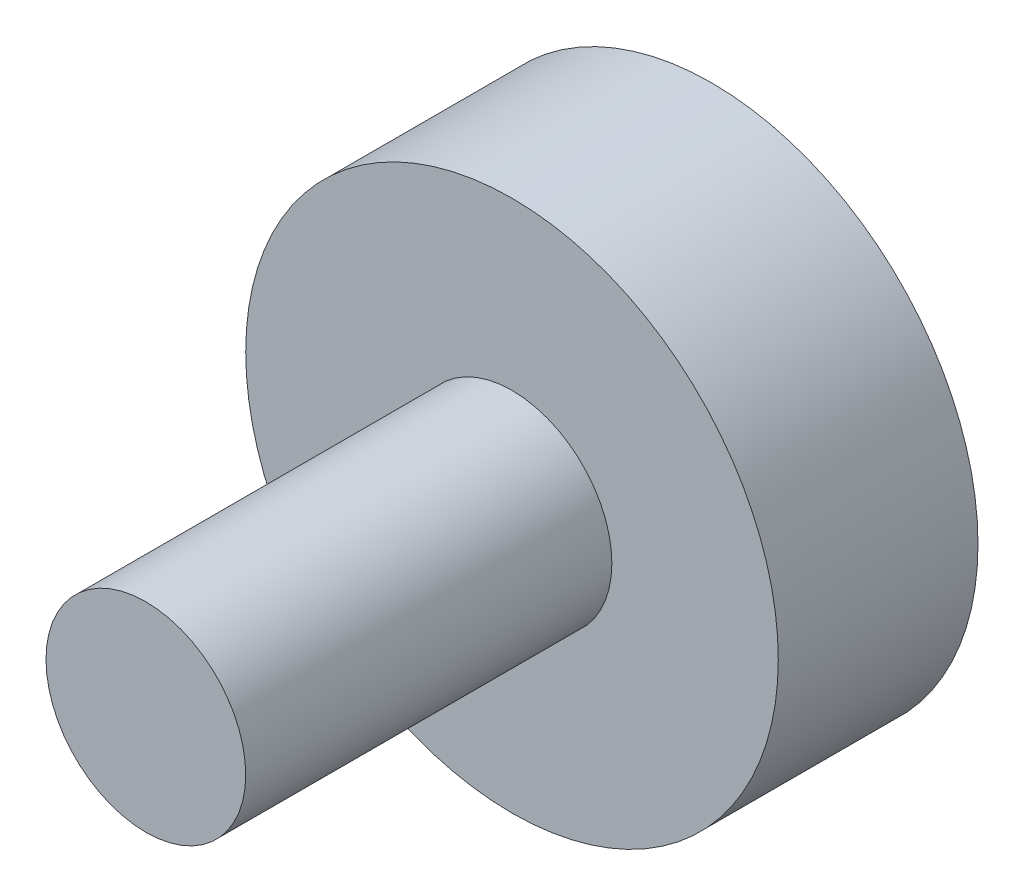
ISO-10303-21;
HEADER;
FILE_DESCRIPTION(('STEP AP214'),'2;1');
FILE_NAME('part.step','',(''),(''),'','','');
FILE_SCHEMA(('AUTOMOTIVE_DESIGN { 1 0 10303 214 1 1 1 1 }'));
ENDSEC;
DATA;
#1=APPLICATION_CONTEXT('core data for automotive mechanical design processes');
#2=APPLICATION_PROTOCOL_DEFINITION('international standard','automotive_design',2000,#1);
#3=PRODUCT_CONTEXT('',#1,'mechanical');
#4=PRODUCT('Part','Part','',(#3));
#5=PRODUCT_RELATED_PRODUCT_CATEGORY('part','',(#4));
#6=PRODUCT_DEFINITION_FORMATION('','',#4);
#7=PRODUCT_DEFINITION_CONTEXT('part definition',#1,'design');
#8=PRODUCT_DEFINITION('design','',#6,#7);
#9=PRODUCT_DEFINITION_SHAPE('','',#8);
#10=(LENGTH_UNIT() NAMED_UNIT(*) SI_UNIT(.MILLI.,.METRE.));
#11=(NAMED_UNIT(*) PLANE_ANGLE_UNIT() SI_UNIT($,.RADIAN.));
#12=(NAMED_UNIT(*) SI_UNIT($,.STERADIAN.) SOLID_ANGLE_UNIT());
#13=UNCERTAINTY_MEASURE_WITH_UNIT(LENGTH_MEASURE(1.E-05),#10,'distance_accuracy_value','');
#14=(GEOMETRIC_REPRESENTATION_CONTEXT(3) GLOBAL_UNCERTAINTY_ASSIGNED_CONTEXT((#13)) GLOBAL_UNIT_ASSIGNED_CONTEXT((#10,
#11,#12)) REPRESENTATION_CONTEXT('',''));
#15=CARTESIAN_POINT('',(0.,0.,0.));
#16=DIRECTION('',(0.,0.,1.));
#17=DIRECTION('',(1.,0.,0.));
#18=AXIS2_PLACEMENT_3D('',#15,#16,#17);
#19=CARTESIAN_POINT('',(0.,0.,76.2));
#20=DIRECTION('',(0.,0.,-1.));
#21=DIRECTION('',(-1.,0.,0.));
#22=AXIS2_PLACEMENT_3D('',#19,#20,#21);
#23=CYLINDRICAL_SURFACE('',#22,101.6);
#24=CARTESIAN_POINT('',(0.,0.,76.2));
#25=DIRECTION('',(0.,0.,1.));
#26=DIRECTION('',(1.,0.,0.));
#27=AXIS2_PLACEMENT_3D('',#24,#25,#26);
#28=CIRCLE('',#27,101.6);
#29=CARTESIAN_POINT('',(-101.6,0.,76.2));
#30=VERTEX_POINT('',#29);
#31=EDGE_CURVE('E45',#30,#30,#28,.T.);
#32=CARTESIAN_POINT('',(0.,0.,0.));
#33=DIRECTION('',(0.,0.,1.));
#34=DIRECTION('',(1.,0.,0.));
#35=AXIS2_PLACEMENT_3D('',#32,#33,#34);
#36=CIRCLE('',#35,101.6);
#37=CARTESIAN_POINT('',(-101.6,0.,0.));
#38=VERTEX_POINT('',#37);
#39=EDGE_CURVE('E40',#38,#38,#36,.T.);
#40=CARTESIAN_POINT('',(-101.6,0.,76.2));
#41=CARTESIAN_POINT('',(-101.6,0.,75.40625));
#42=CARTESIAN_POINT('',(-101.6,0.,74.6125));
#43=CARTESIAN_POINT('',(-101.6,0.,73.025));
#44=CARTESIAN_POINT('',(-101.6,0.,72.23125));
#45=CARTESIAN_POINT('',(-101.6,0.,70.64375));
#46=CARTESIAN_POINT('',(-101.6,0.,69.85));
#47=CARTESIAN_POINT('',(-101.6,0.,68.2625));
#48=CARTESIAN_POINT('',(-101.6,0.,67.46875));
#49=CARTESIAN_POINT('',(-101.6,0.,65.88125));
#50=CARTESIAN_POINT('',(-101.6,0.,65.0875));
#51=CARTESIAN_POINT('',(-101.6,0.,63.5));
#52=CARTESIAN_POINT('',(-101.6,0.,62.70625));
#53=CARTESIAN_POINT('',(-101.6,0.,61.11875));
#54=CARTESIAN_POINT('',(-101.6,0.,60.325));
#55=CARTESIAN_POINT('',(-101.6,0.,58.7375));
#56=CARTESIAN_POINT('',(-101.6,0.,57.94375));
#57=CARTESIAN_POINT('',(-101.6,0.,56.35625));
#58=CARTESIAN_POINT('',(-101.6,0.,55.5625));
#59=CARTESIAN_POINT('',(-101.6,0.,53.975));
#60=CARTESIAN_POINT('',(-101.6,0.,53.18125));
#61=CARTESIAN_POINT('',(-101.6,0.,51.59375));
#62=CARTESIAN_POINT('',(-101.6,0.,50.8));
#63=CARTESIAN_POINT('',(-101.6,0.,49.2125));
#64=CARTESIAN_POINT('',(-101.6,0.,48.41875));
#65=CARTESIAN_POINT('',(-101.6,0.,46.83125));
#66=CARTESIAN_POINT('',(-101.6,0.,46.0375));
#67=CARTESIAN_POINT('',(-101.6,0.,44.45));
#68=CARTESIAN_POINT('',(-101.6,0.,43.65625));
#69=CARTESIAN_POINT('',(-101.6,0.,42.06875));
#70=CARTESIAN_POINT('',(-101.6,0.,41.275));
#71=CARTESIAN_POINT('',(-101.6,0.,39.6875));
#72=CARTESIAN_POINT('',(-101.6,0.,38.89375));
#73=CARTESIAN_POINT('',(-101.6,0.,37.30625));
#74=CARTESIAN_POINT('',(-101.6,0.,36.5125));
#75=CARTESIAN_POINT('',(-101.6,0.,34.925));
#76=CARTESIAN_POINT('',(-101.6,0.,34.13125));
#77=CARTESIAN_POINT('',(-101.6,0.,32.54375));
#78=CARTESIAN_POINT('',(-101.6,0.,31.75));
#79=CARTESIAN_POINT('',(-101.6,0.,30.1625));
#80=CARTESIAN_POINT('',(-101.6,0.,29.36875));
#81=CARTESIAN_POINT('',(-101.6,0.,27.78125));
#82=CARTESIAN_POINT('',(-101.6,0.,26.9875));
#83=CARTESIAN_POINT('',(-101.6,0.,25.4));
#84=CARTESIAN_POINT('',(-101.6,0.,24.60625));
#85=CARTESIAN_POINT('',(-101.6,0.,23.01875));
#86=CARTESIAN_POINT('',(-101.6,0.,22.225));
#87=CARTESIAN_POINT('',(-101.6,0.,20.6375));
#88=CARTESIAN_POINT('',(-101.6,0.,19.84375));
#89=CARTESIAN_POINT('',(-101.6,0.,18.25625));
#90=CARTESIAN_POINT('',(-101.6,0.,17.4625));
#91=CARTESIAN_POINT('',(-101.6,0.,15.875));
#92=CARTESIAN_POINT('',(-101.6,0.,15.08125));
#93=CARTESIAN_POINT('',(-101.6,0.,13.49375));
#94=CARTESIAN_POINT('',(-101.6,0.,12.7));
#95=CARTESIAN_POINT('',(-101.6,0.,11.1125));
#96=CARTESIAN_POINT('',(-101.6,0.,10.31875));
#97=CARTESIAN_POINT('',(-101.6,0.,8.73125));
#98=CARTESIAN_POINT('',(-101.6,0.,7.93750000000001));
#99=CARTESIAN_POINT('',(-101.6,0.,6.35));
#100=CARTESIAN_POINT('',(-101.6,0.,5.55625));
#101=CARTESIAN_POINT('',(-101.6,0.,3.96875));
#102=CARTESIAN_POINT('',(-101.6,0.,3.175));
#103=CARTESIAN_POINT('',(-101.6,0.,1.5875));
#104=CARTESIAN_POINT('',(-101.6,0.,0.793750000000001));
#105=CARTESIAN_POINT('',(-101.6,0.,0.));
#106=B_SPLINE_CURVE_WITH_KNOTS('',3,(#40,#41,#42,#43,#44,#45,#46,#47,#48,#49,#50,#51,#52,#53,
#54,#55,#56,#57,#58,#59,#60,#61,#62,#63,#64,#65,#66,#67,#68,#69,#70,#71,#72,#73,#74,#75,#76,#77,
#78,#79,#80,#81,#82,#83,#84,#85,#86,#87,#88,#89,#90,#91,#92,#93,#94,#95,#96,#97,#98,#99,#100,
#101,#102,#103,#104,#105),.UNSPECIFIED.,.F.,.F.,(4,2,2,2,2,2,2,2,2,2,2,2,2,2,2,2,2,2,2,2,2,2,2,
2,2,2,2,2,2,2,2,2,4),(0.,2.38125,4.7625,7.14375,9.52500000000001,11.90625,14.2875,16.66875,
19.05,21.43125,23.8125,26.19375,28.575,30.95625,33.3375,35.71875,38.1,40.48125,42.8625,45.24375,
47.625,50.00625,52.3875,54.76875,57.15,59.53125,61.9125,64.29375,66.675,69.05625,71.4375,
73.81875,76.2),.UNSPECIFIED.);
#107=EDGE_CURVE('BSEAM37',#30,#38,#106,.T.);
#108=ORIENTED_EDGE('',*,*,#31,.F.);
#109=ORIENTED_EDGE('',*,*,#39,.T.);
#110=ORIENTED_EDGE('',*,*,#107,.T.);
#111=ORIENTED_EDGE('',*,*,#107,.F.);
#112=EDGE_LOOP('',(#108,#110,#109,#111));
#113=FACE_BOUND('',#112,.T.);
#114=ADVANCED_FACE('F37',(#113),#23,.T.);
#115=CARTESIAN_POINT('',(0.,0.,76.2));
#116=DIRECTION('',(0.,0.,1.));
#117=DIRECTION('',(1.,0.,0.));
#118=AXIS2_PLACEMENT_3D('',#115,#116,#117);
#119=PLANE('',#118);
#120=CARTESIAN_POINT('',(0.,0.,76.2));
#121=DIRECTION('',(0.,0.,1.));
#122=DIRECTION('',(1.,0.,0.));
#123=AXIS2_PLACEMENT_3D('',#120,#121,#122);
#124=CIRCLE('',#123,38.1);
#125=CARTESIAN_POINT('',(38.1,0.,76.2));
#126=VERTEX_POINT('',#125);
#127=EDGE_CURVE('E10',#126,#126,#124,.T.);
#128=ORIENTED_EDGE('',*,*,#127,.F.);
#129=EDGE_LOOP('',(#128));
#130=FACE_BOUND('',#129,.T.);
#131=ORIENTED_EDGE('',*,*,#31,.T.);
#132=EDGE_LOOP('',(#131));
#133=FACE_BOUND('',#132,.T.);
#134=ADVANCED_FACE('F65',(#130,#133),#119,.T.);
#135=CARTESIAN_POINT('',(0.,0.,0.));
#136=DIRECTION('',(0.,0.,1.));
#137=DIRECTION('',(1.,0.,0.));
#138=AXIS2_PLACEMENT_3D('',#135,#136,#137);
#139=PLANE('',#138);
#140=ORIENTED_EDGE('',*,*,#39,.F.);
#141=EDGE_LOOP('',(#140));
#142=FACE_BOUND('',#141,.T.);
#143=ADVANCED_FACE('F62',(#142),#139,.F.);
#144=CARTESIAN_POINT('',(0.,0.,215.9));
#145=DIRECTION('',(0.,0.,-1.));
#146=DIRECTION('',(-1.,0.,0.));
#147=AXIS2_PLACEMENT_3D('',#144,#145,#146);
#148=CYLINDRICAL_SURFACE('',#147,38.1);
#149=CARTESIAN_POINT('',(0.,0.,215.9));
#150=DIRECTION('',(0.,0.,1.));
#151=DIRECTION('',(1.,0.,0.));
#152=AXIS2_PLACEMENT_3D('',#149,#150,#151);
#153=CIRCLE('',#152,38.1);
#154=CARTESIAN_POINT('',(38.1,0.,215.9));
#155=VERTEX_POINT('',#154);
#156=EDGE_CURVE('E52',#155,#155,#153,.T.);
#157=ORIENTED_EDGE('',*,*,#156,.F.);
#158=EDGE_LOOP('',(#157));
#159=FACE_BOUND('',#158,.T.);
#160=ORIENTED_EDGE('',*,*,#127,.T.);
#161=EDGE_LOOP('',(#160));
#162=FACE_BOUND('',#161,.T.);
#163=ADVANCED_FACE('F64',(#159,#162),#148,.T.);
#164=CARTESIAN_POINT('',(0.,0.,215.9));
#165=DIRECTION('',(0.,0.,1.));
#166=DIRECTION('',(1.,0.,0.));
#167=AXIS2_PLACEMENT_3D('',#164,#165,#166);
#168=PLANE('',#167);
#169=ORIENTED_EDGE('',*,*,#156,.T.);
#170=EDGE_LOOP('',(#169));
#171=FACE_BOUND('',#170,.T.);
#172=ADVANCED_FACE('F70',(#171),#168,.T.);
#173=CLOSED_SHELL('',(#114,#134,#143,#163,#172));
#174=MANIFOLD_SOLID_BREP('B2',#173);
#175=ADVANCED_BREP_SHAPE_REPRESENTATION('',(#18,#174),#14);
#176=SHAPE_DEFINITION_REPRESENTATION(#9,#175);
ENDSEC;
END-ISO-10303-21;
